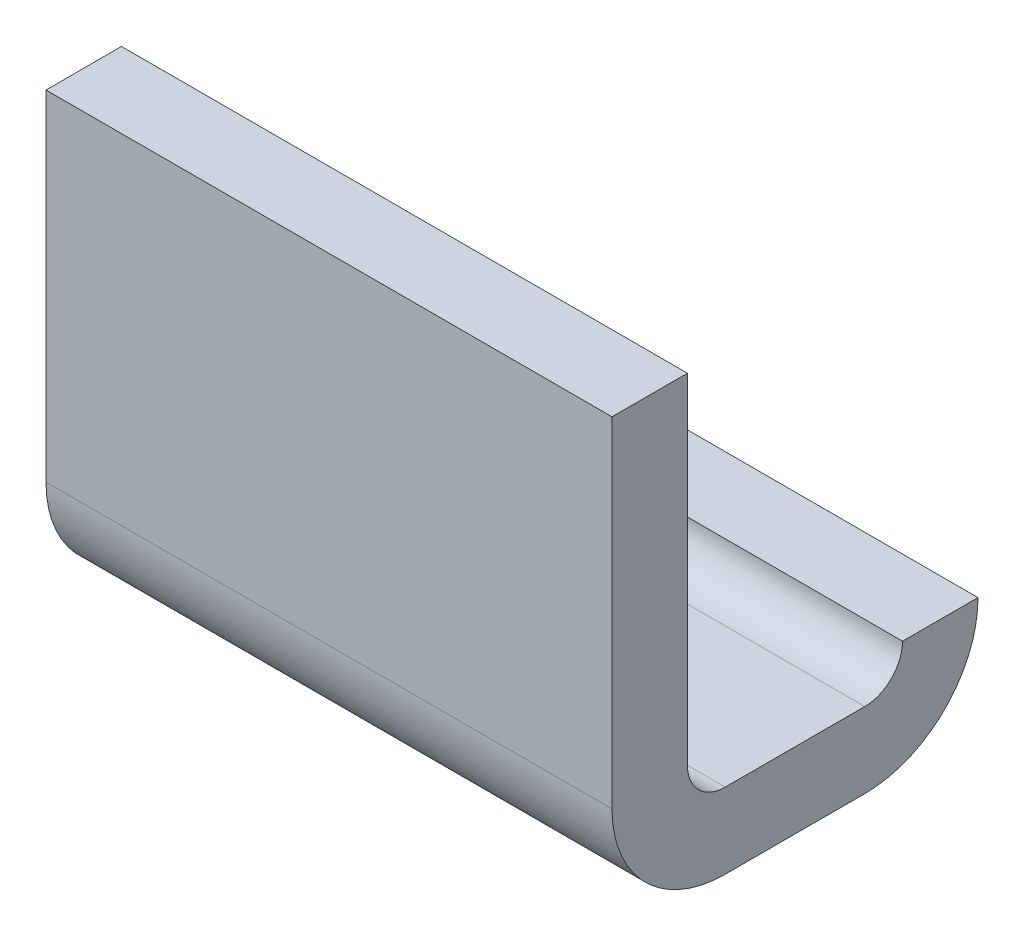
ISO-10303-21;
HEADER;
FILE_DESCRIPTION(('STEP AP214'),'2;1');
FILE_NAME('part.step','',(''),(''),'','','');
FILE_SCHEMA(('AUTOMOTIVE_DESIGN { 1 0 10303 214 1 1 1 1 }'));
ENDSEC;
DATA;
#1=APPLICATION_CONTEXT('core data for automotive mechanical design processes');
#2=APPLICATION_PROTOCOL_DEFINITION('international standard','automotive_design',2000,#1);
#3=PRODUCT_CONTEXT('',#1,'mechanical');
#4=PRODUCT('Part','Part','',(#3));
#5=PRODUCT_RELATED_PRODUCT_CATEGORY('part','',(#4));
#6=PRODUCT_DEFINITION_FORMATION('','',#4);
#7=PRODUCT_DEFINITION_CONTEXT('part definition',#1,'design');
#8=PRODUCT_DEFINITION('design','',#6,#7);
#9=PRODUCT_DEFINITION_SHAPE('','',#8);
#10=(LENGTH_UNIT() NAMED_UNIT(*) SI_UNIT(.MILLI.,.METRE.));
#11=(NAMED_UNIT(*) PLANE_ANGLE_UNIT() SI_UNIT($,.RADIAN.));
#12=(NAMED_UNIT(*) SI_UNIT($,.STERADIAN.) SOLID_ANGLE_UNIT());
#13=UNCERTAINTY_MEASURE_WITH_UNIT(LENGTH_MEASURE(1.E-05),#10,'distance_accuracy_value','');
#14=(GEOMETRIC_REPRESENTATION_CONTEXT(3) GLOBAL_UNCERTAINTY_ASSIGNED_CONTEXT((#13)) GLOBAL_UNIT_ASSIGNED_CONTEXT((#10,
#11,#12)) REPRESENTATION_CONTEXT('',''));
#15=CARTESIAN_POINT('',(0.,0.,0.));
#16=DIRECTION('',(0.,0.,1.));
#17=DIRECTION('',(1.,0.,0.));
#18=AXIS2_PLACEMENT_3D('',#15,#16,#17);
#19=CARTESIAN_POINT('',(-3.65,-26.625,-0.67));
#20=DIRECTION('',(1.,0.,0.));
#21=DIRECTION('',(0.,0.,1.));
#22=AXIS2_PLACEMENT_3D('',#19,#20,#21);
#23=CYLINDRICAL_SURFACE('',#22,0.1);
#24=CARTESIAN_POINT('',(-3.65000000001,-26.62500000001,-0.67000000001));
#25=DIRECTION('',(1.,0.,0.));
#26=DIRECTION('',(0.,-1.,0.));
#27=AXIS2_PLACEMENT_3D('',#24,#25,#26);
#28=CIRCLE('',#27,0.10000000001);
#29=CARTESIAN_POINT('',(-3.65,-26.725,-0.67));
#30=VERTEX_POINT('',#29);
#31=CARTESIAN_POINT('',(-3.65,-26.625,-0.77));
#32=VERTEX_POINT('',#31);
#33=EDGE_CURVE('E40',#30,#32,#28,.T.);
#34=ORIENTED_EDGE('',*,*,#33,.F.);
#35=DIRECTION('',(1.,0.,0.));
#36=VECTOR('',#35,1.);
#37=CARTESIAN_POINT('',(-3.65000000001,-26.72500000001,-0.67000000001));
#38=LINE('',#37,#36);
#39=CARTESIAN_POINT('',(-2.15,-26.725,-0.67));
#40=VERTEX_POINT('',#39);
#41=EDGE_CURVE('E11',#30,#40,#38,.T.);
#42=ORIENTED_EDGE('',*,*,#41,.T.);
#43=CARTESIAN_POINT('',(-2.15000000001,-26.62500000001,-0.67000000001));
#44=DIRECTION('',(-1.,0.,0.));
#45=DIRECTION('',(0.,0.,-1.));
#46=AXIS2_PLACEMENT_3D('',#43,#44,#45);
#47=CIRCLE('',#46,0.10000000001);
#48=CARTESIAN_POINT('',(-2.15,-26.625,-0.77));
#49=VERTEX_POINT('',#48);
#50=EDGE_CURVE('E151',#49,#40,#47,.T.);
#51=ORIENTED_EDGE('',*,*,#50,.F.);
#52=DIRECTION('',(-1.,0.,0.));
#53=VECTOR('',#52,1.);
#54=CARTESIAN_POINT('',(-2.15000000001,-26.62500000001,-0.77000000001));
#55=LINE('',#54,#53);
#56=EDGE_CURVE('E28',#49,#32,#55,.T.);
#57=ORIENTED_EDGE('',*,*,#56,.T.);
#58=EDGE_LOOP('',(#34,#42,#51,#57));
#59=FACE_BOUND('',#58,.T.);
#60=ADVANCED_FACE('F17',(#59),#23,.F.);
#61=CARTESIAN_POINT('',(-3.65,-26.625,-0.97));
#62=DIRECTION('',(0.,-1.,0.));
#63=DIRECTION('',(0.,0.,-1.));
#64=AXIS2_PLACEMENT_3D('',#61,#62,#63);
#65=PLANE('',#64);
#66=DIRECTION('',(0.,0.,1.));
#67=VECTOR('',#66,1.);
#68=CARTESIAN_POINT('',(-3.65000000001,-26.62500000001,-0.97000000001));
#69=LINE('',#68,#67);
#70=CARTESIAN_POINT('',(-3.65,-26.625,-0.97));
#71=VERTEX_POINT('',#70);
#72=EDGE_CURVE('E146',#71,#32,#69,.T.);
#73=ORIENTED_EDGE('',*,*,#72,.T.);
#74=ORIENTED_EDGE('',*,*,#56,.F.);
#75=DIRECTION('',(0.,0.,-1.));
#76=VECTOR('',#75,1.);
#77=CARTESIAN_POINT('',(-2.15000000001,-26.62500000001,-0.77000000001));
#78=LINE('',#77,#76);
#79=CARTESIAN_POINT('',(-2.15,-26.625,-0.97));
#80=VERTEX_POINT('',#79);
#81=EDGE_CURVE('E139',#49,#80,#78,.T.);
#82=ORIENTED_EDGE('',*,*,#81,.T.);
#83=DIRECTION('',(1.,0.,0.));
#84=VECTOR('',#83,1.);
#85=CARTESIAN_POINT('',(-3.65000000001,-26.62500000001,-0.97000000001));
#86=LINE('',#85,#84);
#87=EDGE_CURVE('E130',#71,#80,#86,.T.);
#88=ORIENTED_EDGE('',*,*,#87,.F.);
#89=EDGE_LOOP('',(#73,#74,#82,#88));
#90=FACE_BOUND('',#89,.T.);
#91=ADVANCED_FACE('F144',(#90),#65,.F.);
#92=CARTESIAN_POINT('',(-3.65,-26.625,-0.67));
#93=DIRECTION('',(1.,0.,0.));
#94=DIRECTION('',(0.,0.,1.));
#95=AXIS2_PLACEMENT_3D('',#92,#93,#94);
#96=CYLINDRICAL_SURFACE('',#95,0.3);
#97=ORIENTED_EDGE('',*,*,#87,.T.);
#98=CARTESIAN_POINT('',(-2.15000000001,-26.62500000001,-0.67000000001));
#99=DIRECTION('',(1.,0.,0.));
#100=DIRECTION('',(0.,-1.,0.));
#101=AXIS2_PLACEMENT_3D('',#98,#99,#100);
#102=CIRCLE('',#101,0.30000000001);
#103=CARTESIAN_POINT('',(-2.15,-26.925,-0.67));
#104=VERTEX_POINT('',#103);
#105=EDGE_CURVE('E134',#104,#80,#102,.T.);
#106=ORIENTED_EDGE('',*,*,#105,.F.);
#107=DIRECTION('',(-1.,0.,0.));
#108=VECTOR('',#107,1.);
#109=CARTESIAN_POINT('',(-2.15000000001,-26.92500000001,-0.67000000001));
#110=LINE('',#109,#108);
#111=CARTESIAN_POINT('',(-3.65,-26.925,-0.67));
#112=VERTEX_POINT('',#111);
#113=EDGE_CURVE('E140',#104,#112,#110,.T.);
#114=ORIENTED_EDGE('',*,*,#113,.T.);
#115=CARTESIAN_POINT('',(-3.65000000001,-26.62500000001,-0.67000000001));
#116=DIRECTION('',(-1.,0.,0.));
#117=DIRECTION('',(0.,0.,-1.));
#118=AXIS2_PLACEMENT_3D('',#115,#116,#117);
#119=CIRCLE('',#118,0.30000000001);
#120=EDGE_CURVE('E135',#71,#112,#119,.T.);
#121=ORIENTED_EDGE('',*,*,#120,.F.);
#122=EDGE_LOOP('',(#97,#106,#114,#121));
#123=FACE_BOUND('',#122,.T.);
#124=ADVANCED_FACE('F19',(#123),#96,.T.);
#125=CARTESIAN_POINT('',(-3.65,-26.625,-0.3));
#126=DIRECTION('',(-1.,0.,0.));
#127=DIRECTION('',(0.,0.,1.));
#128=AXIS2_PLACEMENT_3D('',#125,#126,#127);
#129=PLANE('',#128);
#130=DIRECTION('',(0.,1.,0.));
#131=VECTOR('',#130,1.);
#132=CARTESIAN_POINT('',(-3.65000000001,-26.62500000001,-0.20000000001));
#133=LINE('',#132,#131);
#134=CARTESIAN_POINT('',(-3.65,-26.625,-0.2));
#135=VERTEX_POINT('',#134);
#136=CARTESIAN_POINT('',(-3.65,-25.725,-0.2));
#137=VERTEX_POINT('',#136);
#138=EDGE_CURVE('E193',#135,#137,#133,.T.);
#139=ORIENTED_EDGE('',*,*,#138,.F.);
#140=CARTESIAN_POINT('',(-3.65000000001,-26.62500000001,-0.30000000001));
#141=DIRECTION('',(1.,0.,0.));
#142=DIRECTION('',(0.,0.,1.));
#143=AXIS2_PLACEMENT_3D('',#140,#141,#142);
#144=CIRCLE('',#143,0.10000000001);
#145=CARTESIAN_POINT('',(-3.65,-26.725,-0.3));
#146=VERTEX_POINT('',#145);
#147=EDGE_CURVE('E21',#135,#146,#144,.T.);
#148=ORIENTED_EDGE('',*,*,#147,.T.);
#149=DIRECTION('',(0.,0.,1.));
#150=VECTOR('',#149,1.);
#151=CARTESIAN_POINT('',(-3.65000000001,-26.72500000001,-0.67000000001));
#152=LINE('',#151,#150);
#153=EDGE_CURVE('E175',#30,#146,#152,.T.);
#154=ORIENTED_EDGE('',*,*,#153,.F.);
#155=ORIENTED_EDGE('',*,*,#33,.T.);
#156=ORIENTED_EDGE('',*,*,#72,.F.);
#157=ORIENTED_EDGE('',*,*,#120,.T.);
#158=DIRECTION('',(0.,0.,-1.));
#159=VECTOR('',#158,1.);
#160=CARTESIAN_POINT('',(-3.65000000001,-26.92500000001,-0.30000000001));
#161=LINE('',#160,#159);
#162=CARTESIAN_POINT('',(-3.65,-26.925,-0.3));
#163=VERTEX_POINT('',#162);
#164=EDGE_CURVE('E165',#163,#112,#161,.T.);
#165=ORIENTED_EDGE('',*,*,#164,.F.);
#166=CARTESIAN_POINT('',(-3.65000000001,-26.62500000001,-0.30000000001));
#167=DIRECTION('',(-1.,0.,0.));
#168=DIRECTION('',(0.,-1.,0.));
#169=AXIS2_PLACEMENT_3D('',#166,#167,#168);
#170=CIRCLE('',#169,0.30000000001);
#171=CARTESIAN_POINT('',(-3.65,-26.625,0.));
#172=VERTEX_POINT('',#171);
#173=EDGE_CURVE('E227',#163,#172,#170,.T.);
#174=ORIENTED_EDGE('',*,*,#173,.T.);
#175=DIRECTION('',(0.,-1.,0.));
#176=VECTOR('',#175,1.);
#177=CARTESIAN_POINT('',(-3.65000000001,-25.72500000001,0.));
#178=LINE('',#177,#176);
#179=CARTESIAN_POINT('',(-3.65,-25.725,0.));
#180=VERTEX_POINT('',#179);
#181=EDGE_CURVE('E178',#180,#172,#178,.T.);
#182=ORIENTED_EDGE('',*,*,#181,.F.);
#183=DIRECTION('',(0.,0.,1.));
#184=VECTOR('',#183,1.);
#185=CARTESIAN_POINT('',(-3.65000000001,-25.72500000001,-0.20000000001));
#186=LINE('',#185,#184);
#187=EDGE_CURVE('E203',#137,#180,#186,.T.);
#188=ORIENTED_EDGE('',*,*,#187,.F.);
#189=EDGE_LOOP('',(#139,#148,#154,#155,#156,#157,#165,#174,#182,#188));
#190=FACE_BOUND('',#189,.T.);
#191=ADVANCED_FACE('F228',(#190),#129,.T.);
#192=CARTESIAN_POINT('',(-3.65,-25.725,0.));
#193=DIRECTION('',(0.,-1.,0.));
#194=DIRECTION('',(0.,0.,-1.));
#195=AXIS2_PLACEMENT_3D('',#192,#193,#194);
#196=PLANE('',#195);
#197=ORIENTED_EDGE('',*,*,#187,.T.);
#198=DIRECTION('',(-1.,0.,0.));
#199=VECTOR('',#198,1.);
#200=CARTESIAN_POINT('',(-2.15000000001,-25.72500000001,0.));
#201=LINE('',#200,#199);
#202=CARTESIAN_POINT('',(-2.15,-25.725,0.));
#203=VERTEX_POINT('',#202);
#204=EDGE_CURVE('E179',#203,#180,#201,.T.);
#205=ORIENTED_EDGE('',*,*,#204,.F.);
#206=DIRECTION('',(0.,0.,1.));
#207=VECTOR('',#206,1.);
#208=CARTESIAN_POINT('',(-2.15000000001,-25.72500000001,-0.20000000001));
#209=LINE('',#208,#207);
#210=CARTESIAN_POINT('',(-2.15,-25.725,-0.2));
#211=VERTEX_POINT('',#210);
#212=EDGE_CURVE('E156',#211,#203,#209,.T.);
#213=ORIENTED_EDGE('',*,*,#212,.F.);
#214=DIRECTION('',(-1.,0.,0.));
#215=VECTOR('',#214,1.);
#216=CARTESIAN_POINT('',(-2.15000000001,-25.72500000001,-0.20000000001));
#217=LINE('',#216,#215);
#218=EDGE_CURVE('E162',#211,#137,#217,.T.);
#219=ORIENTED_EDGE('',*,*,#218,.T.);
#220=EDGE_LOOP('',(#197,#205,#213,#219));
#221=FACE_BOUND('',#220,.T.);
#222=ADVANCED_FACE('F300',(#221),#196,.F.);
#223=CARTESIAN_POINT('',(-3.65,-25.725,-0.2));
#224=DIRECTION('',(0.,0.,1.));
#225=DIRECTION('',(1.,0.,0.));
#226=AXIS2_PLACEMENT_3D('',#223,#224,#225);
#227=PLANE('',#226);
#228=ORIENTED_EDGE('',*,*,#138,.T.);
#229=ORIENTED_EDGE('',*,*,#218,.F.);
#230=DIRECTION('',(0.,1.,0.));
#231=VECTOR('',#230,1.);
#232=CARTESIAN_POINT('',(-2.15000000001,-26.62500000001,-0.20000000001));
#233=LINE('',#232,#231);
#234=CARTESIAN_POINT('',(-2.15,-26.625,-0.2));
#235=VERTEX_POINT('',#234);
#236=EDGE_CURVE('E169',#235,#211,#233,.T.);
#237=ORIENTED_EDGE('',*,*,#236,.F.);
#238=DIRECTION('',(1.,0.,0.));
#239=VECTOR('',#238,1.);
#240=CARTESIAN_POINT('',(-3.65000000001,-26.62500000001,-0.20000000001));
#241=LINE('',#240,#239);
#242=EDGE_CURVE('E174',#135,#235,#241,.T.);
#243=ORIENTED_EDGE('',*,*,#242,.F.);
#244=EDGE_LOOP('',(#228,#229,#237,#243));
#245=FACE_BOUND('',#244,.T.);
#246=ADVANCED_FACE('F254',(#245),#227,.F.);
#247=CARTESIAN_POINT('',(-3.65,-26.625,-0.3));
#248=DIRECTION('',(1.,0.,0.));
#249=DIRECTION('',(0.,0.,1.));
#250=AXIS2_PLACEMENT_3D('',#247,#248,#249);
#251=CYLINDRICAL_SURFACE('',#250,0.1);
#252=ORIENTED_EDGE('',*,*,#147,.F.);
#253=ORIENTED_EDGE('',*,*,#242,.T.);
#254=CARTESIAN_POINT('',(-2.15000000001,-26.62500000001,-0.30000000001));
#255=DIRECTION('',(-1.,0.,0.));
#256=DIRECTION('',(0.,-1.,0.));
#257=AXIS2_PLACEMENT_3D('',#254,#255,#256);
#258=CIRCLE('',#257,0.10000000001);
#259=CARTESIAN_POINT('',(-2.15,-26.725,-0.3));
#260=VERTEX_POINT('',#259);
#261=EDGE_CURVE('E158',#260,#235,#258,.T.);
#262=ORIENTED_EDGE('',*,*,#261,.F.);
#263=DIRECTION('',(-1.,0.,0.));
#264=VECTOR('',#263,1.);
#265=CARTESIAN_POINT('',(-2.15000000001,-26.72500000001,-0.30000000001));
#266=LINE('',#265,#264);
#267=EDGE_CURVE('E170',#260,#146,#266,.T.);
#268=ORIENTED_EDGE('',*,*,#267,.T.);
#269=EDGE_LOOP('',(#252,#253,#262,#268));
#270=FACE_BOUND('',#269,.T.);
#271=ADVANCED_FACE('F251',(#270),#251,.F.);
#272=CARTESIAN_POINT('',(-3.65,-26.725,-0.3));
#273=DIRECTION('',(0.,-1.,0.));
#274=DIRECTION('',(0.,0.,-1.));
#275=AXIS2_PLACEMENT_3D('',#272,#273,#274);
#276=PLANE('',#275);
#277=ORIENTED_EDGE('',*,*,#153,.T.);
#278=ORIENTED_EDGE('',*,*,#267,.F.);
#279=DIRECTION('',(0.,0.,-1.));
#280=VECTOR('',#279,1.);
#281=CARTESIAN_POINT('',(-2.15000000001,-26.72500000001,-0.30000000001));
#282=LINE('',#281,#280);
#283=EDGE_CURVE('E182',#260,#40,#282,.T.);
#284=ORIENTED_EDGE('',*,*,#283,.T.);
#285=ORIENTED_EDGE('',*,*,#41,.F.);
#286=EDGE_LOOP('',(#277,#278,#284,#285));
#287=FACE_BOUND('',#286,.T.);
#288=ADVANCED_FACE('F242',(#287),#276,.F.);
#289=CARTESIAN_POINT('',(-2.15,-26.625,-0.3));
#290=DIRECTION('',(-1.,0.,0.));
#291=DIRECTION('',(0.,0.,1.));
#292=AXIS2_PLACEMENT_3D('',#289,#290,#291);
#293=PLANE('',#292);
#294=ORIENTED_EDGE('',*,*,#212,.T.);
#295=DIRECTION('',(0.,1.,0.));
#296=VECTOR('',#295,1.);
#297=CARTESIAN_POINT('',(-2.15000000001,-26.62500000001,0.));
#298=LINE('',#297,#296);
#299=CARTESIAN_POINT('',(-2.15,-26.625,0.));
#300=VERTEX_POINT('',#299);
#301=EDGE_CURVE('E97',#300,#203,#298,.T.);
#302=ORIENTED_EDGE('',*,*,#301,.F.);
#303=CARTESIAN_POINT('',(-2.15000000001,-26.62500000001,-0.30000000001));
#304=DIRECTION('',(1.,0.,0.));
#305=DIRECTION('',(0.,-3.33451757111511E-11,1.));
#306=AXIS2_PLACEMENT_3D('',#303,#304,#305);
#307=CIRCLE('',#306,0.30000000001);
#308=CARTESIAN_POINT('',(-2.15,-26.925,-0.3));
#309=VERTEX_POINT('',#308);
#310=EDGE_CURVE('E150',#300,#309,#307,.T.);
#311=ORIENTED_EDGE('',*,*,#310,.T.);
#312=DIRECTION('',(0.,0.,1.));
#313=VECTOR('',#312,1.);
#314=CARTESIAN_POINT('',(-2.15000000001,-26.92500000001,-0.67000000001));
#315=LINE('',#314,#313);
#316=EDGE_CURVE('E105',#104,#309,#315,.T.);
#317=ORIENTED_EDGE('',*,*,#316,.F.);
#318=ORIENTED_EDGE('',*,*,#105,.T.);
#319=ORIENTED_EDGE('',*,*,#81,.F.);
#320=ORIENTED_EDGE('',*,*,#50,.T.);
#321=ORIENTED_EDGE('',*,*,#283,.F.);
#322=ORIENTED_EDGE('',*,*,#261,.T.);
#323=ORIENTED_EDGE('',*,*,#236,.T.);
#324=EDGE_LOOP('',(#294,#302,#311,#317,#318,#319,#320,#321,#322,#323));
#325=FACE_BOUND('',#324,.T.);
#326=ADVANCED_FACE('F148',(#325),#293,.F.);
#327=CARTESIAN_POINT('',(-3.65,-26.925,-0.3));
#328=DIRECTION('',(0.,1.,0.));
#329=DIRECTION('',(1.,0.,0.));
#330=AXIS2_PLACEMENT_3D('',#327,#328,#329);
#331=PLANE('',#330);
#332=ORIENTED_EDGE('',*,*,#164,.T.);
#333=ORIENTED_EDGE('',*,*,#113,.F.);
#334=ORIENTED_EDGE('',*,*,#316,.T.);
#335=DIRECTION('',(1.,0.,0.));
#336=VECTOR('',#335,1.);
#337=CARTESIAN_POINT('',(-3.65000000001,-26.92500000001,-0.30000000001));
#338=LINE('',#337,#336);
#339=EDGE_CURVE('E186',#163,#309,#338,.T.);
#340=ORIENTED_EDGE('',*,*,#339,.F.);
#341=EDGE_LOOP('',(#332,#333,#334,#340));
#342=FACE_BOUND('',#341,.T.);
#343=ADVANCED_FACE('F233',(#342),#331,.F.);
#344=CARTESIAN_POINT('',(-3.65,-26.625,-0.3));
#345=DIRECTION('',(1.,0.,0.));
#346=DIRECTION('',(0.,0.,1.));
#347=AXIS2_PLACEMENT_3D('',#344,#345,#346);
#348=CYLINDRICAL_SURFACE('',#347,0.3);
#349=ORIENTED_EDGE('',*,*,#339,.T.);
#350=ORIENTED_EDGE('',*,*,#310,.F.);
#351=DIRECTION('',(-1.,0.,0.));
#352=VECTOR('',#351,1.);
#353=CARTESIAN_POINT('',(-2.15000000001,-26.62500000001,0.));
#354=LINE('',#353,#352);
#355=EDGE_CURVE('E190',#300,#172,#354,.T.);
#356=ORIENTED_EDGE('',*,*,#355,.T.);
#357=ORIENTED_EDGE('',*,*,#173,.F.);
#358=EDGE_LOOP('',(#349,#350,#356,#357));
#359=FACE_BOUND('',#358,.T.);
#360=ADVANCED_FACE('F232',(#359),#348,.T.);
#361=CARTESIAN_POINT('',(-3.65,-26.625,0.));
#362=DIRECTION('',(0.,0.,-1.));
#363=DIRECTION('',(0.,-1.,0.));
#364=AXIS2_PLACEMENT_3D('',#361,#362,#363);
#365=PLANE('',#364);
#366=ORIENTED_EDGE('',*,*,#181,.T.);
#367=ORIENTED_EDGE('',*,*,#355,.F.);
#368=ORIENTED_EDGE('',*,*,#301,.T.);
#369=ORIENTED_EDGE('',*,*,#204,.T.);
#370=EDGE_LOOP('',(#366,#367,#368,#369));
#371=FACE_BOUND('',#370,.T.);
#372=ADVANCED_FACE('F223',(#371),#365,.F.);
#373=CLOSED_SHELL('',(#60,#91,#124,#191,#222,#246,#271,#288,#326,#343,#360,#372));
#374=MANIFOLD_SOLID_BREP('B1',#373);
#375=ADVANCED_BREP_SHAPE_REPRESENTATION('',(#18,#374),#14);
#376=SHAPE_DEFINITION_REPRESENTATION(#9,#375);
ENDSEC;
END-ISO-10303-21;
